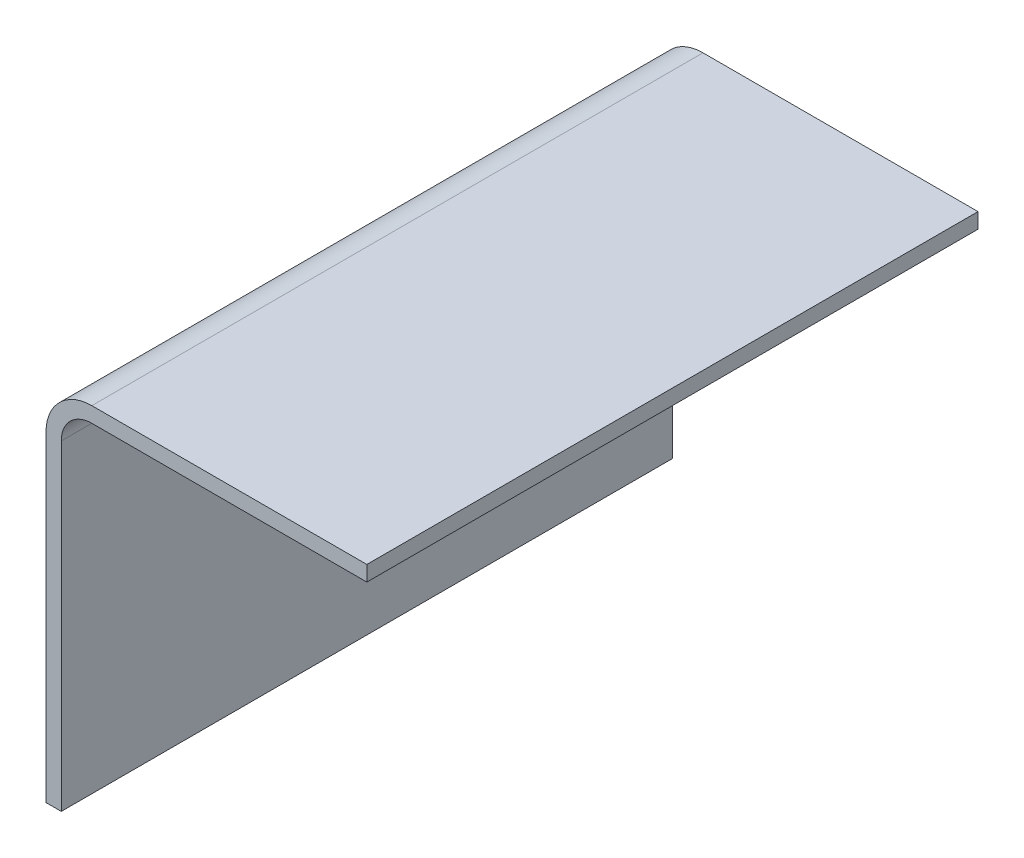
ISO-10303-21;
HEADER;
FILE_DESCRIPTION(('STEP AP214'),'2;1');
FILE_NAME('part.step','',(''),(''),'','','');
FILE_SCHEMA(('AUTOMOTIVE_DESIGN { 1 0 10303 214 1 1 1 1 }'));
ENDSEC;
DATA;
#1=APPLICATION_CONTEXT('core data for automotive mechanical design processes');
#2=APPLICATION_PROTOCOL_DEFINITION('international standard','automotive_design',2000,#1);
#3=PRODUCT_CONTEXT('',#1,'mechanical');
#4=PRODUCT('Part','Part','',(#3));
#5=PRODUCT_RELATED_PRODUCT_CATEGORY('part','',(#4));
#6=PRODUCT_DEFINITION_FORMATION('','',#4);
#7=PRODUCT_DEFINITION_CONTEXT('part definition',#1,'design');
#8=PRODUCT_DEFINITION('design','',#6,#7);
#9=PRODUCT_DEFINITION_SHAPE('','',#8);
#10=(LENGTH_UNIT() NAMED_UNIT(*) SI_UNIT(.MILLI.,.METRE.));
#11=(NAMED_UNIT(*) PLANE_ANGLE_UNIT() SI_UNIT($,.RADIAN.));
#12=(NAMED_UNIT(*) SI_UNIT($,.STERADIAN.) SOLID_ANGLE_UNIT());
#13=UNCERTAINTY_MEASURE_WITH_UNIT(LENGTH_MEASURE(1.E-05),#10,'distance_accuracy_value','');
#14=(GEOMETRIC_REPRESENTATION_CONTEXT(3) GLOBAL_UNCERTAINTY_ASSIGNED_CONTEXT((#13)) GLOBAL_UNIT_ASSIGNED_CONTEXT((#10,
#11,#12)) REPRESENTATION_CONTEXT('',''));
#15=CARTESIAN_POINT('',(0.,0.,0.));
#16=DIRECTION('',(0.,0.,1.));
#17=DIRECTION('',(1.,0.,0.));
#18=AXIS2_PLACEMENT_3D('',#15,#16,#17);
#19=CARTESIAN_POINT('',(10.,115.,200.));
#20=DIRECTION('',(0.,0.,-1.));
#21=DIRECTION('',(-1.,0.,0.));
#22=AXIS2_PLACEMENT_3D('',#19,#20,#21);
#23=CYLINDRICAL_SURFACE('',#22,10.);
#24=CARTESIAN_POINT('',(10.,115.,0.));
#25=DIRECTION('',(0.,0.,-1.));
#26=DIRECTION('',(1.,0.,0.));
#27=AXIS2_PLACEMENT_3D('',#24,#25,#26);
#28=CIRCLE('',#27,10.);
#29=CARTESIAN_POINT('',(0.,115.,0.));
#30=VERTEX_POINT('',#29);
#31=CARTESIAN_POINT('',(10.0000000000001,125.,0.));
#32=VERTEX_POINT('',#31);
#33=EDGE_CURVE('E130',#30,#32,#28,.T.);
#34=ORIENTED_EDGE('',*,*,#33,.T.);
#35=DIRECTION('',(0.,0.,-1.));
#36=VECTOR('',#35,1.);
#37=CARTESIAN_POINT('',(10.0000000000001,125.,200.));
#38=LINE('',#37,#36);
#39=CARTESIAN_POINT('',(10.0000000000001,125.,200.));
#40=VERTEX_POINT('',#39);
#41=EDGE_CURVE('E11',#40,#32,#38,.T.);
#42=ORIENTED_EDGE('',*,*,#41,.F.);
#43=CARTESIAN_POINT('',(10.,115.,200.));
#44=DIRECTION('',(0.,0.,-1.));
#45=DIRECTION('',(1.,0.,0.));
#46=AXIS2_PLACEMENT_3D('',#43,#44,#45);
#47=CIRCLE('',#46,10.);
#48=CARTESIAN_POINT('',(0.,115.,200.));
#49=VERTEX_POINT('',#48);
#50=EDGE_CURVE('E145',#49,#40,#47,.T.);
#51=ORIENTED_EDGE('',*,*,#50,.F.);
#52=DIRECTION('',(0.,0.,-1.));
#53=VECTOR('',#52,1.);
#54=CARTESIAN_POINT('',(0.,115.,200.));
#55=LINE('',#54,#53);
#56=EDGE_CURVE('E126',#49,#30,#55,.T.);
#57=ORIENTED_EDGE('',*,*,#56,.T.);
#58=EDGE_LOOP('',(#34,#42,#51,#57));
#59=FACE_BOUND('',#58,.T.);
#60=ADVANCED_FACE('F35',(#59),#23,.F.);
#61=CARTESIAN_POINT('',(90.,125.,200.));
#62=DIRECTION('',(0.,1.,0.));
#63=DIRECTION('',(0.,0.,1.));
#64=AXIS2_PLACEMENT_3D('',#61,#62,#63);
#65=PLANE('',#64);
#66=DIRECTION('',(1.,0.,0.));
#67=VECTOR('',#66,1.);
#68=CARTESIAN_POINT('',(90.,125.,0.));
#69=LINE('',#68,#67);
#70=CARTESIAN_POINT('',(100.,125.,0.));
#71=VERTEX_POINT('',#70);
#72=EDGE_CURVE('E133',#32,#71,#69,.T.);
#73=ORIENTED_EDGE('',*,*,#72,.T.);
#74=DIRECTION('',(0.,0.,-1.));
#75=VECTOR('',#74,1.);
#76=CARTESIAN_POINT('',(100.,125.,200.));
#77=LINE('',#76,#75);
#78=CARTESIAN_POINT('',(100.,125.,200.));
#79=VERTEX_POINT('',#78);
#80=EDGE_CURVE('E43',#79,#71,#77,.T.);
#81=ORIENTED_EDGE('',*,*,#80,.F.);
#82=DIRECTION('',(1.,0.,0.));
#83=VECTOR('',#82,1.);
#84=CARTESIAN_POINT('',(10.0000000000001,125.,200.));
#85=LINE('',#84,#83);
#86=EDGE_CURVE('E94',#40,#79,#85,.T.);
#87=ORIENTED_EDGE('',*,*,#86,.F.);
#88=ORIENTED_EDGE('',*,*,#41,.T.);
#89=EDGE_LOOP('',(#73,#81,#87,#88));
#90=FACE_BOUND('',#89,.T.);
#91=ADVANCED_FACE('F180',(#90),#65,.F.);
#92=CARTESIAN_POINT('',(100.,130.,200.));
#93=DIRECTION('',(-1.,0.,0.));
#94=DIRECTION('',(0.,0.,1.));
#95=AXIS2_PLACEMENT_3D('',#92,#93,#94);
#96=PLANE('',#95);
#97=DIRECTION('',(0.,1.,0.));
#98=VECTOR('',#97,1.);
#99=CARTESIAN_POINT('',(100.,130.,0.));
#100=LINE('',#99,#98);
#101=CARTESIAN_POINT('',(100.,130.,0.));
#102=VERTEX_POINT('',#101);
#103=EDGE_CURVE('E135',#71,#102,#100,.T.);
#104=ORIENTED_EDGE('',*,*,#103,.T.);
#105=DIRECTION('',(0.,0.,-1.));
#106=VECTOR('',#105,1.);
#107=CARTESIAN_POINT('',(100.,130.,200.));
#108=LINE('',#107,#106);
#109=CARTESIAN_POINT('',(100.,130.,200.));
#110=VERTEX_POINT('',#109);
#111=EDGE_CURVE('E152',#110,#102,#108,.T.);
#112=ORIENTED_EDGE('',*,*,#111,.F.);
#113=DIRECTION('',(0.,1.,0.));
#114=VECTOR('',#113,1.);
#115=CARTESIAN_POINT('',(100.,130.,200.));
#116=LINE('',#115,#114);
#117=EDGE_CURVE('E160',#79,#110,#116,.T.);
#118=ORIENTED_EDGE('',*,*,#117,.F.);
#119=ORIENTED_EDGE('',*,*,#80,.T.);
#120=EDGE_LOOP('',(#104,#112,#118,#119));
#121=FACE_BOUND('',#120,.T.);
#122=ADVANCED_FACE('F158',(#121),#96,.F.);
#123=CARTESIAN_POINT('',(100.,130.,200.));
#124=DIRECTION('',(0.,-1.,0.));
#125=DIRECTION('',(0.,0.,-1.));
#126=AXIS2_PLACEMENT_3D('',#123,#124,#125);
#127=PLANE('',#126);
#128=DIRECTION('',(-1.,0.,0.));
#129=VECTOR('',#128,1.);
#130=CARTESIAN_POINT('',(100.,130.,0.));
#131=LINE('',#130,#129);
#132=CARTESIAN_POINT('',(10.0000000000001,130.,0.));
#133=VERTEX_POINT('',#132);
#134=EDGE_CURVE('E137',#102,#133,#131,.T.);
#135=ORIENTED_EDGE('',*,*,#134,.T.);
#136=DIRECTION('',(0.,0.,-1.));
#137=VECTOR('',#136,1.);
#138=CARTESIAN_POINT('',(10.0000000000001,130.,200.));
#139=LINE('',#138,#137);
#140=CARTESIAN_POINT('',(10.0000000000001,130.,200.));
#141=VERTEX_POINT('',#140);
#142=EDGE_CURVE('E149',#141,#133,#139,.T.);
#143=ORIENTED_EDGE('',*,*,#142,.F.);
#144=DIRECTION('',(-1.,0.,0.));
#145=VECTOR('',#144,1.);
#146=CARTESIAN_POINT('',(100.,130.,200.));
#147=LINE('',#146,#145);
#148=EDGE_CURVE('E172',#110,#141,#147,.T.);
#149=ORIENTED_EDGE('',*,*,#148,.F.);
#150=ORIENTED_EDGE('',*,*,#111,.T.);
#151=EDGE_LOOP('',(#135,#143,#149,#150));
#152=FACE_BOUND('',#151,.T.);
#153=ADVANCED_FACE('F168',(#152),#127,.F.);
#154=CARTESIAN_POINT('',(9.99999999999999,115.,200.));
#155=DIRECTION('',(0.,0.,-1.));
#156=DIRECTION('',(-1.,0.,0.));
#157=AXIS2_PLACEMENT_3D('',#154,#155,#156);
#158=CYLINDRICAL_SURFACE('',#157,15.);
#159=CARTESIAN_POINT('',(9.99999999999999,115.,0.));
#160=DIRECTION('',(0.,0.,1.));
#161=DIRECTION('',(1.,0.,0.));
#162=AXIS2_PLACEMENT_3D('',#159,#160,#161);
#163=CIRCLE('',#162,15.);
#164=CARTESIAN_POINT('',(-5.00000000000001,115.,0.));
#165=VERTEX_POINT('',#164);
#166=EDGE_CURVE('E139',#133,#165,#163,.T.);
#167=ORIENTED_EDGE('',*,*,#166,.T.);
#168=DIRECTION('',(0.,0.,-1.));
#169=VECTOR('',#168,1.);
#170=CARTESIAN_POINT('',(-5.00000000000001,115.,200.));
#171=LINE('',#170,#169);
#172=CARTESIAN_POINT('',(-5.00000000000001,115.,200.));
#173=VERTEX_POINT('',#172);
#174=EDGE_CURVE('E121',#173,#165,#171,.T.);
#175=ORIENTED_EDGE('',*,*,#174,.F.);
#176=CARTESIAN_POINT('',(9.99999999999999,115.,200.));
#177=DIRECTION('',(0.,0.,1.));
#178=DIRECTION('',(1.,0.,0.));
#179=AXIS2_PLACEMENT_3D('',#176,#177,#178);
#180=CIRCLE('',#179,15.);
#181=EDGE_CURVE('E113',#141,#173,#180,.T.);
#182=ORIENTED_EDGE('',*,*,#181,.F.);
#183=ORIENTED_EDGE('',*,*,#142,.T.);
#184=EDGE_LOOP('',(#167,#175,#182,#183));
#185=FACE_BOUND('',#184,.T.);
#186=ADVANCED_FACE('F171',(#185),#158,.T.);
#187=CARTESIAN_POINT('',(-5.00000000000001,20.,200.));
#188=DIRECTION('',(1.,0.,0.));
#189=DIRECTION('',(0.,1.,0.));
#190=AXIS2_PLACEMENT_3D('',#187,#188,#189);
#191=PLANE('',#190);
#192=DIRECTION('',(0.,-1.,0.));
#193=VECTOR('',#192,1.);
#194=CARTESIAN_POINT('',(-5.00000000000001,20.,0.));
#195=LINE('',#194,#193);
#196=CARTESIAN_POINT('',(-5.,10.,0.));
#197=VERTEX_POINT('',#196);
#198=EDGE_CURVE('E120',#165,#197,#195,.T.);
#199=ORIENTED_EDGE('',*,*,#198,.T.);
#200=DIRECTION('',(0.,0.,-1.));
#201=VECTOR('',#200,1.);
#202=CARTESIAN_POINT('',(-5.,10.,200.));
#203=LINE('',#202,#201);
#204=CARTESIAN_POINT('',(-5.,10.,200.));
#205=VERTEX_POINT('',#204);
#206=EDGE_CURVE('E118',#205,#197,#203,.T.);
#207=ORIENTED_EDGE('',*,*,#206,.F.);
#208=DIRECTION('',(0.,-1.,0.));
#209=VECTOR('',#208,1.);
#210=CARTESIAN_POINT('',(-5.00000000000001,115.,200.));
#211=LINE('',#210,#209);
#212=EDGE_CURVE('E107',#173,#205,#211,.T.);
#213=ORIENTED_EDGE('',*,*,#212,.F.);
#214=ORIENTED_EDGE('',*,*,#174,.T.);
#215=EDGE_LOOP('',(#199,#207,#213,#214));
#216=FACE_BOUND('',#215,.T.);
#217=ADVANCED_FACE('F119',(#216),#191,.F.);
#218=CARTESIAN_POINT('',(-5.,10.,200.));
#219=DIRECTION('',(0.,1.,0.));
#220=DIRECTION('',(-1.,0.,0.));
#221=AXIS2_PLACEMENT_3D('',#218,#219,#220);
#222=PLANE('',#221);
#223=DIRECTION('',(1.,0.,0.));
#224=VECTOR('',#223,1.);
#225=CARTESIAN_POINT('',(-5.,10.,0.));
#226=LINE('',#225,#224);
#227=CARTESIAN_POINT('',(0.,10.0000000000001,0.));
#228=VERTEX_POINT('',#227);
#229=EDGE_CURVE('E80',#197,#228,#226,.T.);
#230=ORIENTED_EDGE('',*,*,#229,.T.);
#231=DIRECTION('',(0.,0.,-1.));
#232=VECTOR('',#231,1.);
#233=CARTESIAN_POINT('',(0.,10.0000000000001,200.));
#234=LINE('',#233,#232);
#235=CARTESIAN_POINT('',(0.,10.0000000000001,200.));
#236=VERTEX_POINT('',#235);
#237=EDGE_CURVE('E122',#236,#228,#234,.T.);
#238=ORIENTED_EDGE('',*,*,#237,.F.);
#239=DIRECTION('',(1.,0.,0.));
#240=VECTOR('',#239,1.);
#241=CARTESIAN_POINT('',(-5.,10.,200.));
#242=LINE('',#241,#240);
#243=EDGE_CURVE('E111',#205,#236,#242,.T.);
#244=ORIENTED_EDGE('',*,*,#243,.F.);
#245=ORIENTED_EDGE('',*,*,#206,.T.);
#246=EDGE_LOOP('',(#230,#238,#244,#245));
#247=FACE_BOUND('',#246,.T.);
#248=ADVANCED_FACE('F124',(#247),#222,.F.);
#249=CARTESIAN_POINT('',(0.,10.0000000000001,200.));
#250=DIRECTION('',(-1.,0.,0.));
#251=DIRECTION('',(0.,0.,1.));
#252=AXIS2_PLACEMENT_3D('',#249,#250,#251);
#253=PLANE('',#252);
#254=DIRECTION('',(0.,1.,0.));
#255=VECTOR('',#254,1.);
#256=CARTESIAN_POINT('',(0.,10.0000000000001,0.));
#257=LINE('',#256,#255);
#258=EDGE_CURVE('E86',#228,#30,#257,.T.);
#259=ORIENTED_EDGE('',*,*,#258,.T.);
#260=ORIENTED_EDGE('',*,*,#56,.F.);
#261=DIRECTION('',(0.,1.,0.));
#262=VECTOR('',#261,1.);
#263=CARTESIAN_POINT('',(0.,10.0000000000001,200.));
#264=LINE('',#263,#262);
#265=EDGE_CURVE('E51',#236,#49,#264,.T.);
#266=ORIENTED_EDGE('',*,*,#265,.F.);
#267=ORIENTED_EDGE('',*,*,#237,.T.);
#268=EDGE_LOOP('',(#259,#260,#266,#267));
#269=FACE_BOUND('',#268,.T.);
#270=ADVANCED_FACE('F196',(#269),#253,.F.);
#271=CARTESIAN_POINT('',(10.,115.,200.));
#272=DIRECTION('',(0.,0.,1.));
#273=DIRECTION('',(1.,0.,0.));
#274=AXIS2_PLACEMENT_3D('',#271,#272,#273);
#275=PLANE('',#274);
#276=ORIENTED_EDGE('',*,*,#50,.T.);
#277=ORIENTED_EDGE('',*,*,#86,.T.);
#278=ORIENTED_EDGE('',*,*,#117,.T.);
#279=ORIENTED_EDGE('',*,*,#148,.T.);
#280=ORIENTED_EDGE('',*,*,#181,.T.);
#281=ORIENTED_EDGE('',*,*,#212,.T.);
#282=ORIENTED_EDGE('',*,*,#243,.T.);
#283=ORIENTED_EDGE('',*,*,#265,.T.);
#284=EDGE_LOOP('',(#276,#277,#278,#279,#280,#281,#282,#283));
#285=FACE_BOUND('',#284,.T.);
#286=ADVANCED_FACE('F109',(#285),#275,.T.);
#287=CARTESIAN_POINT('',(10.,115.,0.));
#288=DIRECTION('',(0.,0.,1.));
#289=DIRECTION('',(1.,0.,0.));
#290=AXIS2_PLACEMENT_3D('',#287,#288,#289);
#291=PLANE('',#290);
#292=ORIENTED_EDGE('',*,*,#33,.F.);
#293=ORIENTED_EDGE('',*,*,#258,.F.);
#294=ORIENTED_EDGE('',*,*,#229,.F.);
#295=ORIENTED_EDGE('',*,*,#198,.F.);
#296=ORIENTED_EDGE('',*,*,#166,.F.);
#297=ORIENTED_EDGE('',*,*,#134,.F.);
#298=ORIENTED_EDGE('',*,*,#103,.F.);
#299=ORIENTED_EDGE('',*,*,#72,.F.);
#300=EDGE_LOOP('',(#292,#293,#294,#295,#296,#297,#298,#299));
#301=FACE_BOUND('',#300,.T.);
#302=ADVANCED_FACE('F164',(#301),#291,.F.);
#303=CLOSED_SHELL('',(#60,#91,#122,#153,#186,#217,#248,#270,#286,#302));
#304=MANIFOLD_SOLID_BREP('B2',#303);
#305=ADVANCED_BREP_SHAPE_REPRESENTATION('',(#18,#304),#14);
#306=SHAPE_DEFINITION_REPRESENTATION(#9,#305);
ENDSEC;
END-ISO-10303-21;
